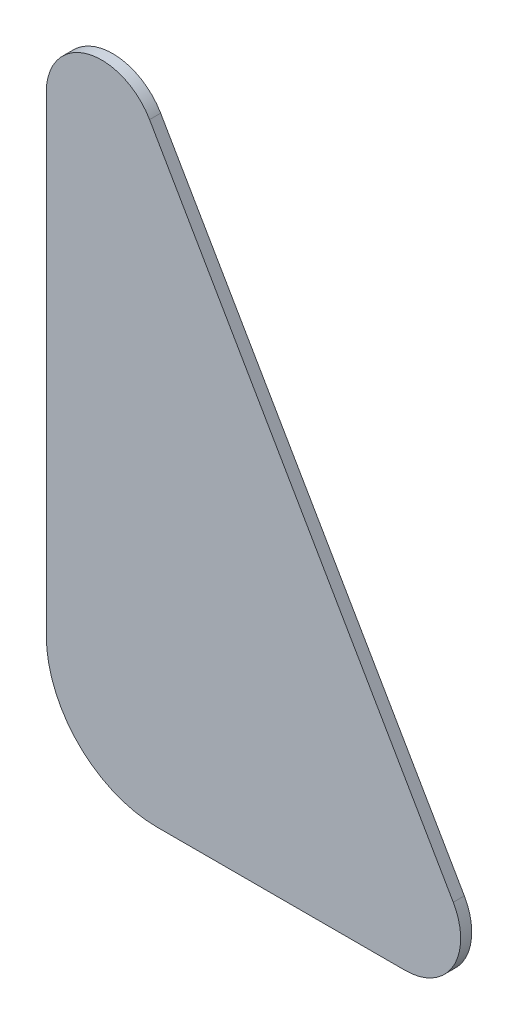
ISO-10303-21;
HEADER;
FILE_DESCRIPTION(('STEP AP214'),'2;1');
FILE_NAME('part.step','',(''),(''),'','','');
FILE_SCHEMA(('AUTOMOTIVE_DESIGN { 1 0 10303 214 1 1 1 1 }'));
ENDSEC;
DATA;
#1=APPLICATION_CONTEXT('core data for automotive mechanical design processes');
#2=APPLICATION_PROTOCOL_DEFINITION('international standard','automotive_design',2000,#1);
#3=PRODUCT_CONTEXT('',#1,'mechanical');
#4=PRODUCT('Part','Part','',(#3));
#5=PRODUCT_RELATED_PRODUCT_CATEGORY('part','',(#4));
#6=PRODUCT_DEFINITION_FORMATION('','',#4);
#7=PRODUCT_DEFINITION_CONTEXT('part definition',#1,'design');
#8=PRODUCT_DEFINITION('design','',#6,#7);
#9=PRODUCT_DEFINITION_SHAPE('','',#8);
#10=(LENGTH_UNIT() NAMED_UNIT(*) SI_UNIT(.MILLI.,.METRE.));
#11=(NAMED_UNIT(*) PLANE_ANGLE_UNIT() SI_UNIT($,.RADIAN.));
#12=(NAMED_UNIT(*) SI_UNIT($,.STERADIAN.) SOLID_ANGLE_UNIT());
#13=UNCERTAINTY_MEASURE_WITH_UNIT(LENGTH_MEASURE(1.E-05),#10,'distance_accuracy_value','');
#14=(GEOMETRIC_REPRESENTATION_CONTEXT(3) GLOBAL_UNCERTAINTY_ASSIGNED_CONTEXT((#13)) GLOBAL_UNIT_ASSIGNED_CONTEXT((#10,
#11,#12)) REPRESENTATION_CONTEXT('',''));
#15=CARTESIAN_POINT('',(0.,0.,0.));
#16=DIRECTION('',(0.,0.,1.));
#17=DIRECTION('',(1.,0.,0.));
#18=AXIS2_PLACEMENT_3D('',#15,#16,#17);
#19=CARTESIAN_POINT('',(100.,100.,10.));
#20=DIRECTION('',(0.,0.,-1.));
#21=DIRECTION('',(-1.,0.,0.));
#22=AXIS2_PLACEMENT_3D('',#19,#20,#21);
#23=CYLINDRICAL_SURFACE('',#22,100.);
#24=CARTESIAN_POINT('',(100.,100.,0.));
#25=DIRECTION('',(0.,0.,1.));
#26=DIRECTION('',(1.,0.,0.));
#27=AXIS2_PLACEMENT_3D('',#24,#25,#26);
#28=CIRCLE('',#27,100.);
#29=CARTESIAN_POINT('',(0.,100.000000000001,0.));
#30=VERTEX_POINT('',#29);
#31=CARTESIAN_POINT('',(100.000000000001,0.,0.));
#32=VERTEX_POINT('',#31);
#33=EDGE_CURVE('E122',#30,#32,#28,.T.);
#34=ORIENTED_EDGE('',*,*,#33,.T.);
#35=DIRECTION('',(0.,0.,-1.));
#36=VECTOR('',#35,1.);
#37=CARTESIAN_POINT('',(100.000000000001,0.,10.));
#38=LINE('',#37,#36);
#39=CARTESIAN_POINT('',(100.000000000001,0.,10.));
#40=VERTEX_POINT('',#39);
#41=EDGE_CURVE('E11',#40,#32,#38,.T.);
#42=ORIENTED_EDGE('',*,*,#41,.F.);
#43=CARTESIAN_POINT('',(100.,100.,10.));
#44=DIRECTION('',(0.,0.,1.));
#45=DIRECTION('',(1.,0.,0.));
#46=AXIS2_PLACEMENT_3D('',#43,#44,#45);
#47=CIRCLE('',#46,100.);
#48=CARTESIAN_POINT('',(0.,100.000000000001,10.));
#49=VERTEX_POINT('',#48);
#50=EDGE_CURVE('E132',#49,#40,#47,.T.);
#51=ORIENTED_EDGE('',*,*,#50,.F.);
#52=DIRECTION('',(0.,0.,-1.));
#53=VECTOR('',#52,1.);
#54=CARTESIAN_POINT('',(0.,100.000000000001,10.));
#55=LINE('',#54,#53);
#56=EDGE_CURVE('E118',#49,#30,#55,.T.);
#57=ORIENTED_EDGE('',*,*,#56,.T.);
#58=EDGE_LOOP('',(#34,#42,#51,#57));
#59=FACE_BOUND('',#58,.T.);
#60=ADVANCED_FACE('F38',(#59),#23,.T.);
#61=CARTESIAN_POINT('',(324.241377865075,0.,10.));
#62=DIRECTION('',(0.,1.,0.));
#63=DIRECTION('',(0.,0.,1.));
#64=AXIS2_PLACEMENT_3D('',#61,#62,#63);
#65=PLANE('',#64);
#66=DIRECTION('',(1.,0.,0.));
#67=VECTOR('',#66,1.);
#68=CARTESIAN_POINT('',(324.241377865075,0.,0.));
#69=LINE('',#68,#67);
#70=CARTESIAN_POINT('',(324.241377865075,0.,0.));
#71=VERTEX_POINT('',#70);
#72=EDGE_CURVE('E125',#32,#71,#69,.T.);
#73=ORIENTED_EDGE('',*,*,#72,.T.);
#74=DIRECTION('',(0.,0.,-1.));
#75=VECTOR('',#74,1.);
#76=CARTESIAN_POINT('',(324.241377865075,0.,10.));
#77=LINE('',#76,#75);
#78=CARTESIAN_POINT('',(324.241377865075,0.,10.));
#79=VERTEX_POINT('',#78);
#80=EDGE_CURVE('E46',#79,#71,#77,.T.);
#81=ORIENTED_EDGE('',*,*,#80,.F.);
#82=DIRECTION('',(1.,0.,0.));
#83=VECTOR('',#82,1.);
#84=CARTESIAN_POINT('',(324.241377865075,0.,10.));
#85=LINE('',#84,#83);
#86=EDGE_CURVE('E91',#40,#79,#85,.T.);
#87=ORIENTED_EDGE('',*,*,#86,.F.);
#88=ORIENTED_EDGE('',*,*,#41,.T.);
#89=EDGE_LOOP('',(#73,#81,#87,#88));
#90=FACE_BOUND('',#89,.T.);
#91=ADVANCED_FACE('F156',(#90),#65,.F.);
#92=CARTESIAN_POINT('',(324.241377865075,50.,10.));
#93=DIRECTION('',(0.,0.,-1.));
#94=DIRECTION('',(-1.,0.,0.));
#95=AXIS2_PLACEMENT_3D('',#92,#93,#94);
#96=CYLINDRICAL_SURFACE('',#95,50.);
#97=CARTESIAN_POINT('',(324.241377865075,50.,0.));
#98=DIRECTION('',(0.,0.,1.));
#99=DIRECTION('',(-1.,0.,0.));
#100=AXIS2_PLACEMENT_3D('',#97,#98,#99);
#101=CIRCLE('',#100,50.);
#102=CARTESIAN_POINT('',(367.542648054297,75.0000000000002,0.));
#103=VERTEX_POINT('',#102);
#104=EDGE_CURVE('E127',#71,#103,#101,.T.);
#105=ORIENTED_EDGE('',*,*,#104,.T.);
#106=DIRECTION('',(0.,0.,-1.));
#107=VECTOR('',#106,1.);
#108=CARTESIAN_POINT('',(367.542648054297,75.0000000000002,10.));
#109=LINE('',#108,#107);
#110=CARTESIAN_POINT('',(367.542648054297,75.0000000000002,10.));
#111=VERTEX_POINT('',#110);
#112=EDGE_CURVE('E113',#111,#103,#109,.T.);
#113=ORIENTED_EDGE('',*,*,#112,.F.);
#114=CARTESIAN_POINT('',(324.241377865075,50.,10.));
#115=DIRECTION('',(0.,0.,1.));
#116=DIRECTION('',(-1.,0.,0.));
#117=AXIS2_PLACEMENT_3D('',#114,#115,#116);
#118=CIRCLE('',#117,50.);
#119=EDGE_CURVE('E104',#79,#111,#118,.T.);
#120=ORIENTED_EDGE('',*,*,#119,.F.);
#121=ORIENTED_EDGE('',*,*,#80,.T.);
#122=EDGE_LOOP('',(#105,#113,#120,#121));
#123=FACE_BOUND('',#122,.T.);
#124=ADVANCED_FACE('F138',(#123),#96,.T.);
#125=CARTESIAN_POINT('',(93.3012701892218,550.,10.));
#126=DIRECTION('',(-0.866025403784436,-0.500000000000004,0.));
#127=DIRECTION('',(0.500000000000004,-0.866025403784436,0.));
#128=AXIS2_PLACEMENT_3D('',#125,#126,#127);
#129=PLANE('',#128);
#130=DIRECTION('',(-0.500000000000004,0.866025403784436,0.));
#131=VECTOR('',#130,1.);
#132=CARTESIAN_POINT('',(93.3012701892218,550.,0.));
#133=LINE('',#132,#131);
#134=CARTESIAN_POINT('',(93.3012701892218,550.,0.));
#135=VERTEX_POINT('',#134);
#136=EDGE_CURVE('E112',#103,#135,#133,.T.);
#137=ORIENTED_EDGE('',*,*,#136,.T.);
#138=DIRECTION('',(0.,0.,-1.));
#139=VECTOR('',#138,1.);
#140=CARTESIAN_POINT('',(93.3012701892218,550.,10.));
#141=LINE('',#140,#139);
#142=CARTESIAN_POINT('',(93.3012701892218,550.,10.));
#143=VERTEX_POINT('',#142);
#144=EDGE_CURVE('E109',#143,#135,#141,.T.);
#145=ORIENTED_EDGE('',*,*,#144,.F.);
#146=DIRECTION('',(-0.500000000000004,0.866025403784436,0.));
#147=VECTOR('',#146,1.);
#148=CARTESIAN_POINT('',(93.3012701892218,550.,10.));
#149=LINE('',#148,#147);
#150=EDGE_CURVE('E98',#111,#143,#149,.T.);
#151=ORIENTED_EDGE('',*,*,#150,.F.);
#152=ORIENTED_EDGE('',*,*,#112,.T.);
#153=EDGE_LOOP('',(#137,#145,#151,#152));
#154=FACE_BOUND('',#153,.T.);
#155=ADVANCED_FACE('F110',(#154),#129,.F.);
#156=CARTESIAN_POINT('',(50.,525.,10.));
#157=DIRECTION('',(0.,0.,-1.));
#158=DIRECTION('',(-1.,0.,0.));
#159=AXIS2_PLACEMENT_3D('',#156,#157,#158);
#160=CYLINDRICAL_SURFACE('',#159,50.);
#161=CARTESIAN_POINT('',(50.,525.,0.));
#162=DIRECTION('',(0.,0.,1.));
#163=DIRECTION('',(-1.,0.,0.));
#164=AXIS2_PLACEMENT_3D('',#161,#162,#163);
#165=CIRCLE('',#164,50.);
#166=CARTESIAN_POINT('',(0.,525.,0.));
#167=VERTEX_POINT('',#166);
#168=EDGE_CURVE('E77',#135,#167,#165,.T.);
#169=ORIENTED_EDGE('',*,*,#168,.T.);
#170=DIRECTION('',(0.,0.,-1.));
#171=VECTOR('',#170,1.);
#172=CARTESIAN_POINT('',(0.,525.,10.));
#173=LINE('',#172,#171);
#174=CARTESIAN_POINT('',(0.,525.,10.));
#175=VERTEX_POINT('',#174);
#176=EDGE_CURVE('E114',#175,#167,#173,.T.);
#177=ORIENTED_EDGE('',*,*,#176,.F.);
#178=CARTESIAN_POINT('',(50.,525.,10.));
#179=DIRECTION('',(0.,0.,1.));
#180=DIRECTION('',(-1.,0.,0.));
#181=AXIS2_PLACEMENT_3D('',#178,#179,#180);
#182=CIRCLE('',#181,50.);
#183=EDGE_CURVE('E102',#143,#175,#182,.T.);
#184=ORIENTED_EDGE('',*,*,#183,.F.);
#185=ORIENTED_EDGE('',*,*,#144,.T.);
#186=EDGE_LOOP('',(#169,#177,#184,#185));
#187=FACE_BOUND('',#186,.T.);
#188=ADVANCED_FACE('F116',(#187),#160,.T.);
#189=CARTESIAN_POINT('',(0.,100.000000000001,10.));
#190=DIRECTION('',(1.,0.,0.));
#191=DIRECTION('',(0.,0.,-1.));
#192=AXIS2_PLACEMENT_3D('',#189,#190,#191);
#193=PLANE('',#192);
#194=DIRECTION('',(0.,-1.,0.));
#195=VECTOR('',#194,1.);
#196=CARTESIAN_POINT('',(0.,100.000000000001,0.));
#197=LINE('',#196,#195);
#198=EDGE_CURVE('E83',#167,#30,#197,.T.);
#199=ORIENTED_EDGE('',*,*,#198,.T.);
#200=ORIENTED_EDGE('',*,*,#56,.F.);
#201=DIRECTION('',(0.,-1.,0.));
#202=VECTOR('',#201,1.);
#203=CARTESIAN_POINT('',(0.,100.000000000001,10.));
#204=LINE('',#203,#202);
#205=EDGE_CURVE('E54',#175,#49,#204,.T.);
#206=ORIENTED_EDGE('',*,*,#205,.F.);
#207=ORIENTED_EDGE('',*,*,#176,.T.);
#208=EDGE_LOOP('',(#199,#200,#206,#207));
#209=FACE_BOUND('',#208,.T.);
#210=ADVANCED_FACE('F145',(#209),#193,.F.);
#211=CARTESIAN_POINT('',(100.,100.,10.));
#212=DIRECTION('',(0.,0.,1.));
#213=DIRECTION('',(1.,0.,0.));
#214=AXIS2_PLACEMENT_3D('',#211,#212,#213);
#215=PLANE('',#214);
#216=ORIENTED_EDGE('',*,*,#50,.T.);
#217=ORIENTED_EDGE('',*,*,#86,.T.);
#218=ORIENTED_EDGE('',*,*,#119,.T.);
#219=ORIENTED_EDGE('',*,*,#150,.T.);
#220=ORIENTED_EDGE('',*,*,#183,.T.);
#221=ORIENTED_EDGE('',*,*,#205,.T.);
#222=EDGE_LOOP('',(#216,#217,#218,#219,#220,#221));
#223=FACE_BOUND('',#222,.T.);
#224=ADVANCED_FACE('F100',(#223),#215,.T.);
#225=CARTESIAN_POINT('',(100.,100.,0.));
#226=DIRECTION('',(0.,0.,1.));
#227=DIRECTION('',(1.,0.,0.));
#228=AXIS2_PLACEMENT_3D('',#225,#226,#227);
#229=PLANE('',#228);
#230=ORIENTED_EDGE('',*,*,#33,.F.);
#231=ORIENTED_EDGE('',*,*,#198,.F.);
#232=ORIENTED_EDGE('',*,*,#168,.F.);
#233=ORIENTED_EDGE('',*,*,#136,.F.);
#234=ORIENTED_EDGE('',*,*,#104,.F.);
#235=ORIENTED_EDGE('',*,*,#72,.F.);
#236=EDGE_LOOP('',(#230,#231,#232,#233,#234,#235));
#237=FACE_BOUND('',#236,.T.);
#238=ADVANCED_FACE('F141',(#237),#229,.F.);
#239=CLOSED_SHELL('',(#60,#91,#124,#155,#188,#210,#224,#238));
#240=MANIFOLD_SOLID_BREP('B2',#239);
#241=ADVANCED_BREP_SHAPE_REPRESENTATION('',(#18,#240),#14);
#242=SHAPE_DEFINITION_REPRESENTATION(#9,#241);
ENDSEC;
END-ISO-10303-21;
